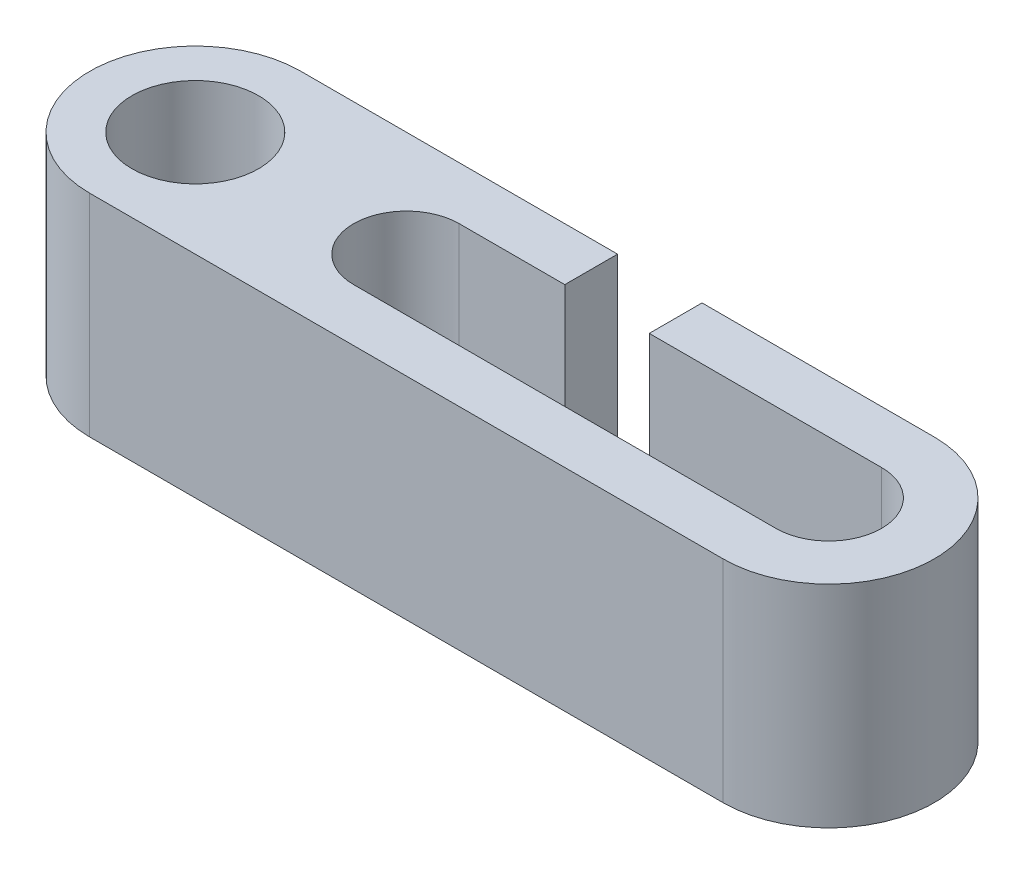
ISO-10303-21;
HEADER;
FILE_DESCRIPTION(('STEP AP214'),'2;1');
FILE_NAME('part.step','',(''),(''),'','','');
FILE_SCHEMA(('AUTOMOTIVE_DESIGN { 1 0 10303 214 1 1 1 1 }'));
ENDSEC;
DATA;
#1=APPLICATION_CONTEXT('core data for automotive mechanical design processes');
#2=APPLICATION_PROTOCOL_DEFINITION('international standard','automotive_design',2000,#1);
#3=PRODUCT_CONTEXT('',#1,'mechanical');
#4=PRODUCT('Part','Part','',(#3));
#5=PRODUCT_RELATED_PRODUCT_CATEGORY('part','',(#4));
#6=PRODUCT_DEFINITION_FORMATION('','',#4);
#7=PRODUCT_DEFINITION_CONTEXT('part definition',#1,'design');
#8=PRODUCT_DEFINITION('design','',#6,#7);
#9=PRODUCT_DEFINITION_SHAPE('','',#8);
#10=(LENGTH_UNIT() NAMED_UNIT(*) SI_UNIT(.MILLI.,.METRE.));
#11=(NAMED_UNIT(*) PLANE_ANGLE_UNIT() SI_UNIT($,.RADIAN.));
#12=(NAMED_UNIT(*) SI_UNIT($,.STERADIAN.) SOLID_ANGLE_UNIT());
#13=UNCERTAINTY_MEASURE_WITH_UNIT(LENGTH_MEASURE(1.E-05),#10,'distance_accuracy_value','');
#14=(GEOMETRIC_REPRESENTATION_CONTEXT(3) GLOBAL_UNCERTAINTY_ASSIGNED_CONTEXT((#13)) GLOBAL_UNIT_ASSIGNED_CONTEXT((#10,
#11,#12)) REPRESENTATION_CONTEXT('',''));
#15=CARTESIAN_POINT('',(0.,0.,0.));
#16=DIRECTION('',(0.,0.,1.));
#17=DIRECTION('',(1.,0.,0.));
#18=AXIS2_PLACEMENT_3D('',#15,#16,#17);
#19=CARTESIAN_POINT('',(-45.8925331931354,10.,-10.0214283254318));
#20=DIRECTION('',(0.,1.,0.));
#21=DIRECTION('',(0.,0.,1.));
#22=AXIS2_PLACEMENT_3D('',#19,#20,#21);
#23=PLANE('',#22);
#24=CARTESIAN_POINT('',(-45.8925331931354,10.,-10.0214283254318));
#25=DIRECTION('',(0.,1.,0.));
#26=DIRECTION('',(0.,0.,1.));
#27=AXIS2_PLACEMENT_3D('',#24,#25,#26);
#28=CIRCLE('',#27,5.);
#29=CARTESIAN_POINT('',(-45.8925331931354,10.,-15.0214283254318));
#30=VERTEX_POINT('',#29);
#31=CARTESIAN_POINT('',(-45.8925331931354,10.,-5.02142832543184));
#32=VERTEX_POINT('',#31);
#33=EDGE_CURVE('E177',#30,#32,#28,.T.);
#34=ORIENTED_EDGE('',*,*,#33,.T.);
#35=DIRECTION('',(1.,0.,0.));
#36=VECTOR('',#35,1.);
#37=CARTESIAN_POINT('',(-45.8925331931354,10.,-5.02142832543184));
#38=LINE('',#37,#36);
#39=CARTESIAN_POINT('',(-15.8925331931354,10.,-5.02142832543184));
#40=VERTEX_POINT('',#39);
#41=EDGE_CURVE('E105',#32,#40,#38,.T.);
#42=ORIENTED_EDGE('',*,*,#41,.T.);
#43=CARTESIAN_POINT('',(-15.8925331931354,10.,-10.0214283254318));
#44=DIRECTION('',(0.,1.,0.));
#45=DIRECTION('',(0.,0.,1.));
#46=AXIS2_PLACEMENT_3D('',#43,#44,#45);
#47=CIRCLE('',#46,5.);
#48=CARTESIAN_POINT('',(-15.8925331931354,10.,-15.0214283254318));
#49=VERTEX_POINT('',#48);
#50=EDGE_CURVE('E204',#40,#49,#47,.T.);
#51=ORIENTED_EDGE('',*,*,#50,.T.);
#52=DIRECTION('',(-1.,0.,0.));
#53=VECTOR('',#52,1.);
#54=CARTESIAN_POINT('',(-26.8925331931354,10.,-15.0214283254318));
#55=LINE('',#54,#53);
#56=CARTESIAN_POINT('',(-26.8925331931354,10.,-15.0214283254318));
#57=VERTEX_POINT('',#56);
#58=EDGE_CURVE('E223',#49,#57,#55,.T.);
#59=ORIENTED_EDGE('',*,*,#58,.T.);
#60=DIRECTION('',(0.,0.,1.));
#61=VECTOR('',#60,1.);
#62=CARTESIAN_POINT('',(-26.8925331931354,10.,-12.5214283254318));
#63=LINE('',#62,#61);
#64=CARTESIAN_POINT('',(-26.8925331931354,10.,-12.5214283254318));
#65=VERTEX_POINT('',#64);
#66=EDGE_CURVE('E220',#57,#65,#63,.T.);
#67=ORIENTED_EDGE('',*,*,#66,.T.);
#68=DIRECTION('',(1.,0.,0.));
#69=VECTOR('',#68,1.);
#70=CARTESIAN_POINT('',(-26.8925331931354,10.,-12.5214283254318));
#71=LINE('',#70,#69);
#72=CARTESIAN_POINT('',(-15.8925331931354,10.,-12.5214283254318));
#73=VERTEX_POINT('',#72);
#74=EDGE_CURVE('E222',#65,#73,#71,.T.);
#75=ORIENTED_EDGE('',*,*,#74,.T.);
#76=CARTESIAN_POINT('',(-15.8925331931354,10.,-10.0214283254318));
#77=DIRECTION('',(0.,-1.,0.));
#78=DIRECTION('',(0.,0.,1.));
#79=AXIS2_PLACEMENT_3D('',#76,#77,#78);
#80=CIRCLE('',#79,2.5);
#81=CARTESIAN_POINT('',(-15.8925331931354,10.,-7.52142832543183));
#82=VERTEX_POINT('',#81);
#83=EDGE_CURVE('E225',#73,#82,#80,.T.);
#84=ORIENTED_EDGE('',*,*,#83,.T.);
#85=DIRECTION('',(-1.,0.,0.));
#86=VECTOR('',#85,1.);
#87=CARTESIAN_POINT('',(-35.8925331931354,10.,-7.52142832543184));
#88=LINE('',#87,#86);
#89=CARTESIAN_POINT('',(-35.8925331931354,10.,-7.52142832543184));
#90=VERTEX_POINT('',#89);
#91=EDGE_CURVE('E231',#82,#90,#88,.T.);
#92=ORIENTED_EDGE('',*,*,#91,.T.);
#93=CARTESIAN_POINT('',(-35.8925331931354,10.,-10.0214283254318));
#94=DIRECTION('',(0.,-1.,0.));
#95=DIRECTION('',(0.,0.,1.));
#96=AXIS2_PLACEMENT_3D('',#93,#94,#95);
#97=CIRCLE('',#96,2.5);
#98=CARTESIAN_POINT('',(-35.8925331931354,10.,-12.5214283254318));
#99=VERTEX_POINT('',#98);
#100=EDGE_CURVE('E136',#90,#99,#97,.T.);
#101=ORIENTED_EDGE('',*,*,#100,.T.);
#102=DIRECTION('',(1.,0.,0.));
#103=VECTOR('',#102,1.);
#104=CARTESIAN_POINT('',(-35.8925331931354,10.,-12.5214283254318));
#105=LINE('',#104,#103);
#106=CARTESIAN_POINT('',(-30.8925331931354,10.,-12.5214283254318));
#107=VERTEX_POINT('',#106);
#108=EDGE_CURVE('E130',#99,#107,#105,.T.);
#109=ORIENTED_EDGE('',*,*,#108,.T.);
#110=DIRECTION('',(0.,0.,-1.));
#111=VECTOR('',#110,1.);
#112=CARTESIAN_POINT('',(-30.8925331931354,10.,-12.5214283254318));
#113=LINE('',#112,#111);
#114=CARTESIAN_POINT('',(-30.8925331931354,10.,-15.0214283254318));
#115=VERTEX_POINT('',#114);
#116=EDGE_CURVE('E134',#107,#115,#113,.T.);
#117=ORIENTED_EDGE('',*,*,#116,.T.);
#118=DIRECTION('',(-1.,0.,0.));
#119=VECTOR('',#118,1.);
#120=CARTESIAN_POINT('',(-45.8925331931354,10.,-15.0214283254318));
#121=LINE('',#120,#119);
#122=EDGE_CURVE('E50',#115,#30,#121,.T.);
#123=ORIENTED_EDGE('',*,*,#122,.T.);
#124=EDGE_LOOP('',(#34,#42,#51,#59,#67,#75,#84,#92,#101,#109,#117,#123));
#125=FACE_BOUND('',#124,.T.);
#126=CARTESIAN_POINT('',(-45.8925331931354,10.,-10.0214283254318));
#127=DIRECTION('',(0.,1.,0.));
#128=DIRECTION('',(0.,0.,1.));
#129=AXIS2_PLACEMENT_3D('',#126,#127,#128);
#130=CIRCLE('',#129,3.);
#131=CARTESIAN_POINT('',(-45.8925331931354,10.,-7.02142832543184));
#132=VERTEX_POINT('',#131);
#133=EDGE_CURVE('E158',#132,#132,#130,.T.);
#134=ORIENTED_EDGE('',*,*,#133,.F.);
#135=EDGE_LOOP('',(#134));
#136=FACE_BOUND('',#135,.T.);
#137=ADVANCED_FACE('F33',(#125,#136),#23,.T.);
#138=CARTESIAN_POINT('',(-45.8925331931354,0.,-10.0214283254318));
#139=DIRECTION('',(0.,1.,0.));
#140=DIRECTION('',(0.,0.,1.));
#141=AXIS2_PLACEMENT_3D('',#138,#139,#140);
#142=PLANE('',#141);
#143=CARTESIAN_POINT('',(-45.8925331931354,0.,-10.0214283254318));
#144=DIRECTION('',(0.,1.,0.));
#145=DIRECTION('',(0.,0.,1.));
#146=AXIS2_PLACEMENT_3D('',#143,#144,#145);
#147=CIRCLE('',#146,5.);
#148=CARTESIAN_POINT('',(-45.8925331931354,0.,-15.0214283254318));
#149=VERTEX_POINT('',#148);
#150=CARTESIAN_POINT('',(-45.8925331931354,0.,-5.02142832543184));
#151=VERTEX_POINT('',#150);
#152=EDGE_CURVE('E154',#149,#151,#147,.T.);
#153=ORIENTED_EDGE('',*,*,#152,.F.);
#154=DIRECTION('',(-1.,0.,0.));
#155=VECTOR('',#154,1.);
#156=CARTESIAN_POINT('',(-45.8925331931354,0.,-15.0214283254318));
#157=LINE('',#156,#155);
#158=CARTESIAN_POINT('',(-30.8925331931354,0.,-15.0214283254318));
#159=VERTEX_POINT('',#158);
#160=EDGE_CURVE('E97',#159,#149,#157,.T.);
#161=ORIENTED_EDGE('',*,*,#160,.F.);
#162=DIRECTION('',(0.,0.,-1.));
#163=VECTOR('',#162,1.);
#164=CARTESIAN_POINT('',(-30.8925331931354,0.,-12.5214283254318));
#165=LINE('',#164,#163);
#166=CARTESIAN_POINT('',(-30.8925331931354,0.,-12.5214283254318));
#167=VERTEX_POINT('',#166);
#168=EDGE_CURVE('E91',#167,#159,#165,.T.);
#169=ORIENTED_EDGE('',*,*,#168,.F.);
#170=DIRECTION('',(1.,0.,0.));
#171=VECTOR('',#170,1.);
#172=CARTESIAN_POINT('',(-35.8925331931354,0.,-12.5214283254318));
#173=LINE('',#172,#171);
#174=CARTESIAN_POINT('',(-35.8925331931354,0.,-12.5214283254318));
#175=VERTEX_POINT('',#174);
#176=EDGE_CURVE('E144',#175,#167,#173,.T.);
#177=ORIENTED_EDGE('',*,*,#176,.F.);
#178=CARTESIAN_POINT('',(-35.8925331931354,0.,-10.0214283254318));
#179=DIRECTION('',(0.,-1.,0.));
#180=DIRECTION('',(0.,0.,1.));
#181=AXIS2_PLACEMENT_3D('',#178,#179,#180);
#182=CIRCLE('',#181,2.5);
#183=CARTESIAN_POINT('',(-35.8925331931354,0.,-7.52142832543184));
#184=VERTEX_POINT('',#183);
#185=EDGE_CURVE('E172',#184,#175,#182,.T.);
#186=ORIENTED_EDGE('',*,*,#185,.F.);
#187=DIRECTION('',(-1.,0.,0.));
#188=VECTOR('',#187,1.);
#189=CARTESIAN_POINT('',(-35.8925331931354,0.,-7.52142832543184));
#190=LINE('',#189,#188);
#191=CARTESIAN_POINT('',(-15.8925331931354,0.,-7.52142832543183));
#192=VERTEX_POINT('',#191);
#193=EDGE_CURVE('E170',#192,#184,#190,.T.);
#194=ORIENTED_EDGE('',*,*,#193,.F.);
#195=CARTESIAN_POINT('',(-15.8925331931354,0.,-10.0214283254318));
#196=DIRECTION('',(0.,-1.,0.));
#197=DIRECTION('',(0.,0.,1.));
#198=AXIS2_PLACEMENT_3D('',#195,#196,#197);
#199=CIRCLE('',#198,2.5);
#200=CARTESIAN_POINT('',(-15.8925331931354,0.,-12.5214283254318));
#201=VERTEX_POINT('',#200);
#202=EDGE_CURVE('E168',#201,#192,#199,.T.);
#203=ORIENTED_EDGE('',*,*,#202,.F.);
#204=DIRECTION('',(1.,0.,0.));
#205=VECTOR('',#204,1.);
#206=CARTESIAN_POINT('',(-26.8925331931354,0.,-12.5214283254318));
#207=LINE('',#206,#205);
#208=CARTESIAN_POINT('',(-26.8925331931354,0.,-12.5214283254318));
#209=VERTEX_POINT('',#208);
#210=EDGE_CURVE('E166',#209,#201,#207,.T.);
#211=ORIENTED_EDGE('',*,*,#210,.F.);
#212=DIRECTION('',(0.,0.,1.));
#213=VECTOR('',#212,1.);
#214=CARTESIAN_POINT('',(-26.8925331931354,0.,-12.5214283254318));
#215=LINE('',#214,#213);
#216=CARTESIAN_POINT('',(-26.8925331931354,0.,-15.0214283254318));
#217=VERTEX_POINT('',#216);
#218=EDGE_CURVE('E164',#217,#209,#215,.T.);
#219=ORIENTED_EDGE('',*,*,#218,.F.);
#220=DIRECTION('',(-1.,0.,0.));
#221=VECTOR('',#220,1.);
#222=CARTESIAN_POINT('',(-26.8925331931354,0.,-15.0214283254318));
#223=LINE('',#222,#221);
#224=CARTESIAN_POINT('',(-15.8925331931354,0.,-15.0214283254318));
#225=VERTEX_POINT('',#224);
#226=EDGE_CURVE('E162',#225,#217,#223,.T.);
#227=ORIENTED_EDGE('',*,*,#226,.F.);
#228=CARTESIAN_POINT('',(-15.8925331931354,0.,-10.0214283254318));
#229=DIRECTION('',(0.,1.,0.));
#230=DIRECTION('',(0.,0.,1.));
#231=AXIS2_PLACEMENT_3D('',#228,#229,#230);
#232=CIRCLE('',#231,5.);
#233=CARTESIAN_POINT('',(-15.8925331931354,0.,-5.02142832543184));
#234=VERTEX_POINT('',#233);
#235=EDGE_CURVE('E160',#234,#225,#232,.T.);
#236=ORIENTED_EDGE('',*,*,#235,.F.);
#237=DIRECTION('',(1.,0.,0.));
#238=VECTOR('',#237,1.);
#239=CARTESIAN_POINT('',(-45.8925331931354,0.,-5.02142832543184));
#240=LINE('',#239,#238);
#241=EDGE_CURVE('E157',#151,#234,#240,.T.);
#242=ORIENTED_EDGE('',*,*,#241,.F.);
#243=EDGE_LOOP('',(#153,#161,#169,#177,#186,#194,#203,#211,#219,#227,#236,#242));
#244=FACE_BOUND('',#243,.T.);
#245=CARTESIAN_POINT('',(-45.8925331931354,0.,-10.0214283254318));
#246=DIRECTION('',(0.,1.,0.));
#247=DIRECTION('',(0.,0.,1.));
#248=AXIS2_PLACEMENT_3D('',#245,#246,#247);
#249=CIRCLE('',#248,3.);
#250=CARTESIAN_POINT('',(-45.8925331931354,0.,-7.02142832543184));
#251=VERTEX_POINT('',#250);
#252=EDGE_CURVE('E378',#251,#251,#249,.T.);
#253=ORIENTED_EDGE('',*,*,#252,.T.);
#254=EDGE_LOOP('',(#253));
#255=FACE_BOUND('',#254,.T.);
#256=ADVANCED_FACE('F208',(#244,#255),#142,.F.);
#257=CARTESIAN_POINT('',(-45.8925331931354,10.,-10.0214283254318));
#258=DIRECTION('',(0.,-1.,0.));
#259=DIRECTION('',(0.,0.,-1.));
#260=AXIS2_PLACEMENT_3D('',#257,#258,#259);
#261=CYLINDRICAL_SURFACE('',#260,5.);
#262=ORIENTED_EDGE('',*,*,#152,.T.);
#263=DIRECTION('',(0.,-1.,0.));
#264=VECTOR('',#263,1.);
#265=CARTESIAN_POINT('',(-45.8925331931354,10.,-5.02142832543184));
#266=LINE('',#265,#264);
#267=EDGE_CURVE('E11',#32,#151,#266,.T.);
#268=ORIENTED_EDGE('',*,*,#267,.F.);
#269=ORIENTED_EDGE('',*,*,#33,.F.);
#270=DIRECTION('',(0.,-1.,0.));
#271=VECTOR('',#270,1.);
#272=CARTESIAN_POINT('',(-45.8925331931354,10.,-15.0214283254318));
#273=LINE('',#272,#271);
#274=EDGE_CURVE('E150',#30,#149,#273,.T.);
#275=ORIENTED_EDGE('',*,*,#274,.T.);
#276=EDGE_LOOP('',(#262,#268,#269,#275));
#277=FACE_BOUND('',#276,.T.);
#278=ADVANCED_FACE('F35',(#277),#261,.T.);
#279=CARTESIAN_POINT('',(-45.8925331931354,10.,-5.02142832543184));
#280=DIRECTION('',(0.,0.,-1.));
#281=DIRECTION('',(-1.,0.,0.));
#282=AXIS2_PLACEMENT_3D('',#279,#280,#281);
#283=PLANE('',#282);
#284=ORIENTED_EDGE('',*,*,#241,.T.);
#285=DIRECTION('',(0.,-1.,0.));
#286=VECTOR('',#285,1.);
#287=CARTESIAN_POINT('',(-15.8925331931354,10.,-5.02142832543184));
#288=LINE('',#287,#286);
#289=EDGE_CURVE('E42',#40,#234,#288,.T.);
#290=ORIENTED_EDGE('',*,*,#289,.F.);
#291=ORIENTED_EDGE('',*,*,#41,.F.);
#292=ORIENTED_EDGE('',*,*,#267,.T.);
#293=EDGE_LOOP('',(#284,#290,#291,#292));
#294=FACE_BOUND('',#293,.T.);
#295=ADVANCED_FACE('F265',(#294),#283,.F.);
#296=CARTESIAN_POINT('',(-15.8925331931354,10.,-10.0214283254318));
#297=DIRECTION('',(0.,-1.,0.));
#298=DIRECTION('',(0.,0.,-1.));
#299=AXIS2_PLACEMENT_3D('',#296,#297,#298);
#300=CYLINDRICAL_SURFACE('',#299,5.);
#301=ORIENTED_EDGE('',*,*,#235,.T.);
#302=DIRECTION('',(0.,-1.,0.));
#303=VECTOR('',#302,1.);
#304=CARTESIAN_POINT('',(-15.8925331931354,10.,-15.0214283254318));
#305=LINE('',#304,#303);
#306=EDGE_CURVE('E196',#49,#225,#305,.T.);
#307=ORIENTED_EDGE('',*,*,#306,.F.);
#308=ORIENTED_EDGE('',*,*,#50,.F.);
#309=ORIENTED_EDGE('',*,*,#289,.T.);
#310=EDGE_LOOP('',(#301,#307,#308,#309));
#311=FACE_BOUND('',#310,.T.);
#312=ADVANCED_FACE('F202',(#311),#300,.T.);
#313=CARTESIAN_POINT('',(-26.8925331931354,10.,-15.0214283254318));
#314=DIRECTION('',(0.,0.,1.));
#315=DIRECTION('',(1.,0.,0.));
#316=AXIS2_PLACEMENT_3D('',#313,#314,#315);
#317=PLANE('',#316);
#318=ORIENTED_EDGE('',*,*,#226,.T.);
#319=DIRECTION('',(0.,-1.,0.));
#320=VECTOR('',#319,1.);
#321=CARTESIAN_POINT('',(-26.8925331931354,10.,-15.0214283254318));
#322=LINE('',#321,#320);
#323=EDGE_CURVE('E193',#57,#217,#322,.T.);
#324=ORIENTED_EDGE('',*,*,#323,.F.);
#325=ORIENTED_EDGE('',*,*,#58,.F.);
#326=ORIENTED_EDGE('',*,*,#306,.T.);
#327=EDGE_LOOP('',(#318,#324,#325,#326));
#328=FACE_BOUND('',#327,.T.);
#329=ADVANCED_FACE('F214',(#328),#317,.F.);
#330=CARTESIAN_POINT('',(-26.8925331931354,10.,-12.5214283254318));
#331=DIRECTION('',(1.,0.,0.));
#332=DIRECTION('',(0.,0.,-1.));
#333=AXIS2_PLACEMENT_3D('',#330,#331,#332);
#334=PLANE('',#333);
#335=ORIENTED_EDGE('',*,*,#218,.T.);
#336=DIRECTION('',(0.,-1.,0.));
#337=VECTOR('',#336,1.);
#338=CARTESIAN_POINT('',(-26.8925331931354,10.,-12.5214283254318));
#339=LINE('',#338,#337);
#340=EDGE_CURVE('E190',#65,#209,#339,.T.);
#341=ORIENTED_EDGE('',*,*,#340,.F.);
#342=ORIENTED_EDGE('',*,*,#66,.F.);
#343=ORIENTED_EDGE('',*,*,#323,.T.);
#344=EDGE_LOOP('',(#335,#341,#342,#343));
#345=FACE_BOUND('',#344,.T.);
#346=ADVANCED_FACE('F218',(#345),#334,.F.);
#347=CARTESIAN_POINT('',(-26.8925331931354,10.,-12.5214283254318));
#348=DIRECTION('',(0.,0.,-1.));
#349=DIRECTION('',(-1.,0.,0.));
#350=AXIS2_PLACEMENT_3D('',#347,#348,#349);
#351=PLANE('',#350);
#352=ORIENTED_EDGE('',*,*,#210,.T.);
#353=DIRECTION('',(0.,-1.,0.));
#354=VECTOR('',#353,1.);
#355=CARTESIAN_POINT('',(-15.8925331931354,10.,-12.5214283254318));
#356=LINE('',#355,#354);
#357=EDGE_CURVE('E187',#73,#201,#356,.T.);
#358=ORIENTED_EDGE('',*,*,#357,.F.);
#359=ORIENTED_EDGE('',*,*,#74,.F.);
#360=ORIENTED_EDGE('',*,*,#340,.T.);
#361=EDGE_LOOP('',(#352,#358,#359,#360));
#362=FACE_BOUND('',#361,.T.);
#363=ADVANCED_FACE('F278',(#362),#351,.F.);
#364=CARTESIAN_POINT('',(-15.8925331931354,10.,-10.0214283254318));
#365=DIRECTION('',(0.,-1.,0.));
#366=DIRECTION('',(0.,0.,-1.));
#367=AXIS2_PLACEMENT_3D('',#364,#365,#366);
#368=CYLINDRICAL_SURFACE('',#367,2.5);
#369=ORIENTED_EDGE('',*,*,#202,.T.);
#370=DIRECTION('',(0.,-1.,0.));
#371=VECTOR('',#370,1.);
#372=CARTESIAN_POINT('',(-15.8925331931354,10.,-7.52142832543183));
#373=LINE('',#372,#371);
#374=EDGE_CURVE('E184',#82,#192,#373,.T.);
#375=ORIENTED_EDGE('',*,*,#374,.F.);
#376=ORIENTED_EDGE('',*,*,#83,.F.);
#377=ORIENTED_EDGE('',*,*,#357,.T.);
#378=EDGE_LOOP('',(#369,#375,#376,#377));
#379=FACE_BOUND('',#378,.T.);
#380=ADVANCED_FACE('F281',(#379),#368,.F.);
#381=CARTESIAN_POINT('',(-35.8925331931354,10.,-7.52142832543184));
#382=DIRECTION('',(0.,0.,1.));
#383=DIRECTION('',(1.,0.,0.));
#384=AXIS2_PLACEMENT_3D('',#381,#382,#383);
#385=PLANE('',#384);
#386=ORIENTED_EDGE('',*,*,#193,.T.);
#387=DIRECTION('',(0.,-1.,0.));
#388=VECTOR('',#387,1.);
#389=CARTESIAN_POINT('',(-35.8925331931354,10.,-7.52142832543184));
#390=LINE('',#389,#388);
#391=EDGE_CURVE('E181',#90,#184,#390,.T.);
#392=ORIENTED_EDGE('',*,*,#391,.F.);
#393=ORIENTED_EDGE('',*,*,#91,.F.);
#394=ORIENTED_EDGE('',*,*,#374,.T.);
#395=EDGE_LOOP('',(#386,#392,#393,#394));
#396=FACE_BOUND('',#395,.T.);
#397=ADVANCED_FACE('F237',(#396),#385,.F.);
#398=CARTESIAN_POINT('',(-35.8925331931354,10.,-10.0214283254318));
#399=DIRECTION('',(0.,-1.,0.));
#400=DIRECTION('',(0.,0.,-1.));
#401=AXIS2_PLACEMENT_3D('',#398,#399,#400);
#402=CYLINDRICAL_SURFACE('',#401,2.5);
#403=ORIENTED_EDGE('',*,*,#185,.T.);
#404=DIRECTION('',(0.,-1.,0.));
#405=VECTOR('',#404,1.);
#406=CARTESIAN_POINT('',(-35.8925331931354,10.,-12.5214283254318));
#407=LINE('',#406,#405);
#408=EDGE_CURVE('E145',#99,#175,#407,.T.);
#409=ORIENTED_EDGE('',*,*,#408,.F.);
#410=ORIENTED_EDGE('',*,*,#100,.F.);
#411=ORIENTED_EDGE('',*,*,#391,.T.);
#412=EDGE_LOOP('',(#403,#409,#410,#411));
#413=FACE_BOUND('',#412,.T.);
#414=ADVANCED_FACE('F241',(#413),#402,.F.);
#415=CARTESIAN_POINT('',(-35.8925331931354,10.,-12.5214283254318));
#416=DIRECTION('',(0.,0.,-1.));
#417=DIRECTION('',(-1.,0.,0.));
#418=AXIS2_PLACEMENT_3D('',#415,#416,#417);
#419=PLANE('',#418);
#420=ORIENTED_EDGE('',*,*,#176,.T.);
#421=DIRECTION('',(0.,-1.,0.));
#422=VECTOR('',#421,1.);
#423=CARTESIAN_POINT('',(-30.8925331931354,10.,-12.5214283254318));
#424=LINE('',#423,#422);
#425=EDGE_CURVE('E141',#107,#167,#424,.T.);
#426=ORIENTED_EDGE('',*,*,#425,.F.);
#427=ORIENTED_EDGE('',*,*,#108,.F.);
#428=ORIENTED_EDGE('',*,*,#408,.T.);
#429=EDGE_LOOP('',(#420,#426,#427,#428));
#430=FACE_BOUND('',#429,.T.);
#431=ADVANCED_FACE('F142',(#430),#419,.F.);
#432=CARTESIAN_POINT('',(-30.8925331931354,10.,-12.5214283254318));
#433=DIRECTION('',(-1.,0.,0.));
#434=DIRECTION('',(0.,0.,1.));
#435=AXIS2_PLACEMENT_3D('',#432,#433,#434);
#436=PLANE('',#435);
#437=ORIENTED_EDGE('',*,*,#168,.T.);
#438=DIRECTION('',(0.,-1.,0.));
#439=VECTOR('',#438,1.);
#440=CARTESIAN_POINT('',(-30.8925331931354,10.,-15.0214283254318));
#441=LINE('',#440,#439);
#442=EDGE_CURVE('E146',#115,#159,#441,.T.);
#443=ORIENTED_EDGE('',*,*,#442,.F.);
#444=ORIENTED_EDGE('',*,*,#116,.F.);
#445=ORIENTED_EDGE('',*,*,#425,.T.);
#446=EDGE_LOOP('',(#437,#443,#444,#445));
#447=FACE_BOUND('',#446,.T.);
#448=ADVANCED_FACE('F148',(#447),#436,.F.);
#449=CARTESIAN_POINT('',(-45.8925331931354,10.,-15.0214283254318));
#450=DIRECTION('',(0.,0.,1.));
#451=DIRECTION('',(1.,0.,0.));
#452=AXIS2_PLACEMENT_3D('',#449,#450,#451);
#453=PLANE('',#452);
#454=ORIENTED_EDGE('',*,*,#160,.T.);
#455=ORIENTED_EDGE('',*,*,#274,.F.);
#456=ORIENTED_EDGE('',*,*,#122,.F.);
#457=ORIENTED_EDGE('',*,*,#442,.T.);
#458=EDGE_LOOP('',(#454,#455,#456,#457));
#459=FACE_BOUND('',#458,.T.);
#460=ADVANCED_FACE('F245',(#459),#453,.F.);
#461=CARTESIAN_POINT('',(-45.8925331931354,10.,-10.0214283254318));
#462=DIRECTION('',(0.,-1.,0.));
#463=DIRECTION('',(0.,0.,-1.));
#464=AXIS2_PLACEMENT_3D('',#461,#462,#463);
#465=CYLINDRICAL_SURFACE('',#464,3.);
#466=ORIENTED_EDGE('',*,*,#133,.T.);
#467=EDGE_LOOP('',(#466));
#468=FACE_BOUND('',#467,.T.);
#469=ORIENTED_EDGE('',*,*,#252,.F.);
#470=EDGE_LOOP('',(#469));
#471=FACE_BOUND('',#470,.T.);
#472=ADVANCED_FACE('F247',(#468,#471),#465,.F.);
#473=CLOSED_SHELL('',(#137,#256,#278,#295,#312,#329,#346,#363,#380,#397,#414,#431,#448,#460,#472));
#474=MANIFOLD_SOLID_BREP('B2',#473);
#475=ADVANCED_BREP_SHAPE_REPRESENTATION('',(#18,#474),#14);
#476=SHAPE_DEFINITION_REPRESENTATION(#9,#475);
ENDSEC;
END-ISO-10303-21;
